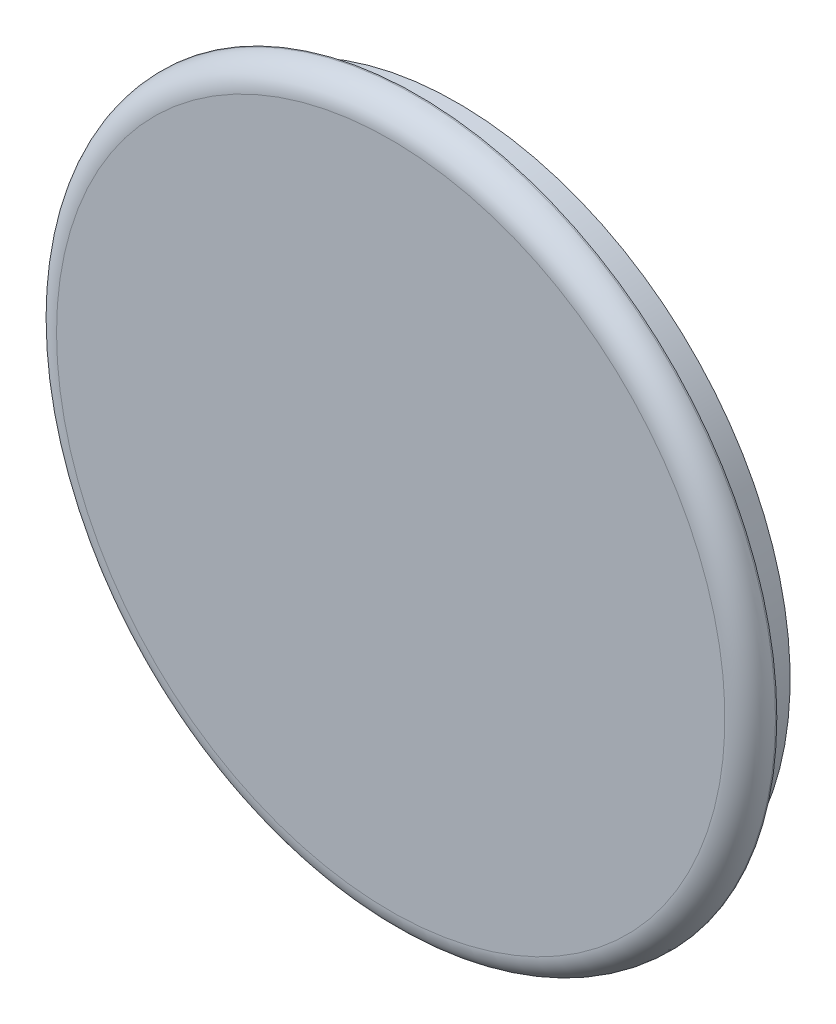
ISO-10303-21;
HEADER;
FILE_DESCRIPTION(('STEP AP214'),'2;1');
FILE_NAME('part.step','',(''),(''),'','','');
FILE_SCHEMA(('AUTOMOTIVE_DESIGN { 1 0 10303 214 1 1 1 1 }'));
ENDSEC;
DATA;
#1=APPLICATION_CONTEXT('core data for automotive mechanical design processes');
#2=APPLICATION_PROTOCOL_DEFINITION('international standard','automotive_design',2000,#1);
#3=PRODUCT_CONTEXT('',#1,'mechanical');
#4=PRODUCT('Part','Part','',(#3));
#5=PRODUCT_RELATED_PRODUCT_CATEGORY('part','',(#4));
#6=PRODUCT_DEFINITION_FORMATION('','',#4);
#7=PRODUCT_DEFINITION_CONTEXT('part definition',#1,'design');
#8=PRODUCT_DEFINITION('design','',#6,#7);
#9=PRODUCT_DEFINITION_SHAPE('','',#8);
#10=(LENGTH_UNIT() NAMED_UNIT(*) SI_UNIT(.MILLI.,.METRE.));
#11=(NAMED_UNIT(*) PLANE_ANGLE_UNIT() SI_UNIT($,.RADIAN.));
#12=(NAMED_UNIT(*) SI_UNIT($,.STERADIAN.) SOLID_ANGLE_UNIT());
#13=UNCERTAINTY_MEASURE_WITH_UNIT(LENGTH_MEASURE(1.E-05),#10,'distance_accuracy_value','');
#14=(GEOMETRIC_REPRESENTATION_CONTEXT(3) GLOBAL_UNCERTAINTY_ASSIGNED_CONTEXT((#13)) GLOBAL_UNIT_ASSIGNED_CONTEXT((#10,
#11,#12)) REPRESENTATION_CONTEXT('',''));
#15=CARTESIAN_POINT('',(0.,0.,0.));
#16=DIRECTION('',(0.,0.,1.));
#17=DIRECTION('',(1.,0.,0.));
#18=AXIS2_PLACEMENT_3D('',#15,#16,#17);
#19=CARTESIAN_POINT('',(0.,0.,0.));
#20=DIRECTION('',(0.,0.,-1.));
#21=DIRECTION('',(-1.,0.,0.));
#22=AXIS2_PLACEMENT_3D('',#19,#20,#21);
#23=PLANE('',#22);
#24=CARTESIAN_POINT('',(0.,0.,0.));
#25=DIRECTION('',(0.,0.,-1.));
#26=DIRECTION('',(-1.,0.,0.));
#27=AXIS2_PLACEMENT_3D('',#24,#25,#26);
#28=CIRCLE('',#27,25.1);
#29=CARTESIAN_POINT('',(-25.1,0.,0.));
#30=VERTEX_POINT('',#29);
#31=EDGE_CURVE('E10',#30,#30,#28,.T.);
#32=ORIENTED_EDGE('',*,*,#31,.F.);
#33=EDGE_LOOP('',(#32));
#34=FACE_BOUND('',#33,.T.);
#35=ADVANCED_FACE('F35',(#34),#23,.F.);
#36=CARTESIAN_POINT('',(0.,0.,-1.9));
#37=DIRECTION('',(0.,0.,-1.));
#38=DIRECTION('',(-1.,0.,0.));
#39=AXIS2_PLACEMENT_3D('',#36,#37,#38);
#40=TOROIDAL_SURFACE('',#39,25.1,1.9);
#41=CARTESIAN_POINT('',(0.,0.,-1.90000000000002));
#42=DIRECTION('',(0.,0.,-1.));
#43=DIRECTION('',(-1.,0.,0.));
#44=AXIS2_PLACEMENT_3D('',#41,#42,#43);
#45=CIRCLE('',#44,27.);
#46=CARTESIAN_POINT('',(-27.,0.,-1.90000000000002));
#47=VERTEX_POINT('',#46);
#48=EDGE_CURVE('E41',#47,#47,#45,.T.);
#49=ORIENTED_EDGE('',*,*,#48,.F.);
#50=EDGE_LOOP('',(#49));
#51=FACE_BOUND('',#50,.T.);
#52=ORIENTED_EDGE('',*,*,#31,.T.);
#53=EDGE_LOOP('',(#52));
#54=FACE_BOUND('',#53,.T.);
#55=ADVANCED_FACE('F92',(#51,#54),#40,.T.);
#56=CARTESIAN_POINT('',(0.,0.,-2.));
#57=DIRECTION('',(0.,0.,-1.));
#58=DIRECTION('',(-1.,0.,0.));
#59=AXIS2_PLACEMENT_3D('',#56,#57,#58);
#60=CYLINDRICAL_SURFACE('',#59,27.);
#61=CARTESIAN_POINT('',(0.,0.,-2.));
#62=DIRECTION('',(0.,0.,-1.));
#63=DIRECTION('',(-1.,0.,0.));
#64=AXIS2_PLACEMENT_3D('',#61,#62,#63);
#65=CIRCLE('',#64,27.);
#66=CARTESIAN_POINT('',(-27.,0.,-2.00000000000001));
#67=VERTEX_POINT('',#66);
#68=EDGE_CURVE('E45',#67,#67,#65,.T.);
#69=ORIENTED_EDGE('',*,*,#68,.F.);
#70=EDGE_LOOP('',(#69));
#71=FACE_BOUND('',#70,.T.);
#72=ORIENTED_EDGE('',*,*,#48,.T.);
#73=EDGE_LOOP('',(#72));
#74=FACE_BOUND('',#73,.T.);
#75=ADVANCED_FACE('F87',(#71,#74),#60,.T.);
#76=CARTESIAN_POINT('',(27.,0.,-2.));
#77=DIRECTION('',(0.,0.,1.));
#78=DIRECTION('',(1.,0.,0.));
#79=AXIS2_PLACEMENT_3D('',#76,#77,#78);
#80=PLANE('',#79);
#81=CARTESIAN_POINT('',(0.,0.,-2.));
#82=DIRECTION('',(0.,0.,-1.));
#83=DIRECTION('',(-1.,0.,0.));
#84=AXIS2_PLACEMENT_3D('',#81,#82,#83);
#85=CIRCLE('',#84,25.);
#86=CARTESIAN_POINT('',(-25.,0.,-2.00000000000001));
#87=VERTEX_POINT('',#86);
#88=EDGE_CURVE('E49',#87,#87,#85,.T.);
#89=ORIENTED_EDGE('',*,*,#88,.F.);
#90=EDGE_LOOP('',(#89));
#91=FACE_BOUND('',#90,.T.);
#92=ORIENTED_EDGE('',*,*,#68,.T.);
#93=EDGE_LOOP('',(#92));
#94=FACE_BOUND('',#93,.T.);
#95=ADVANCED_FACE('F81',(#91,#94),#80,.F.);
#96=CARTESIAN_POINT('',(0.,0.,-2.));
#97=DIRECTION('',(0.,0.,-1.));
#98=DIRECTION('',(-1.,0.,0.));
#99=AXIS2_PLACEMENT_3D('',#96,#97,#98);
#100=CYLINDRICAL_SURFACE('',#99,25.);
#101=CARTESIAN_POINT('',(0.,0.,-5.));
#102=DIRECTION('',(0.,0.,-1.));
#103=DIRECTION('',(-1.,0.,0.));
#104=AXIS2_PLACEMENT_3D('',#101,#102,#103);
#105=CIRCLE('',#104,25.);
#106=CARTESIAN_POINT('',(-25.,0.,-5.));
#107=VERTEX_POINT('',#106);
#108=EDGE_CURVE('E54',#107,#107,#105,.T.);
#109=ORIENTED_EDGE('',*,*,#108,.F.);
#110=EDGE_LOOP('',(#109));
#111=FACE_BOUND('',#110,.T.);
#112=ORIENTED_EDGE('',*,*,#88,.T.);
#113=EDGE_LOOP('',(#112));
#114=FACE_BOUND('',#113,.T.);
#115=ADVANCED_FACE('F75',(#111,#114),#100,.T.);
#116=CARTESIAN_POINT('',(25.,0.,-5.));
#117=DIRECTION('',(0.,0.,1.));
#118=DIRECTION('',(1.,0.,0.));
#119=AXIS2_PLACEMENT_3D('',#116,#117,#118);
#120=PLANE('',#119);
#121=CARTESIAN_POINT('',(0.,0.,-5.));
#122=DIRECTION('',(0.,0.,-1.));
#123=DIRECTION('',(-1.,0.,0.));
#124=AXIS2_PLACEMENT_3D('',#121,#122,#123);
#125=CIRCLE('',#124,23.);
#126=CARTESIAN_POINT('',(-23.,0.,-5.));
#127=VERTEX_POINT('',#126);
#128=EDGE_CURVE('E57',#127,#127,#125,.T.);
#129=ORIENTED_EDGE('',*,*,#128,.F.);
#130=EDGE_LOOP('',(#129));
#131=FACE_BOUND('',#130,.T.);
#132=ORIENTED_EDGE('',*,*,#108,.T.);
#133=EDGE_LOOP('',(#132));
#134=FACE_BOUND('',#133,.T.);
#135=ADVANCED_FACE('F69',(#131,#134),#120,.F.);
#136=CARTESIAN_POINT('',(0.,0.,-2.));
#137=DIRECTION('',(0.,0.,-1.));
#138=DIRECTION('',(-1.,0.,0.));
#139=AXIS2_PLACEMENT_3D('',#136,#137,#138);
#140=CYLINDRICAL_SURFACE('',#139,23.);
#141=CARTESIAN_POINT('',(0.,0.,-2.));
#142=DIRECTION('',(0.,0.,-1.));
#143=DIRECTION('',(-1.,0.,0.));
#144=AXIS2_PLACEMENT_3D('',#141,#142,#143);
#145=CIRCLE('',#144,23.);
#146=CARTESIAN_POINT('',(-23.,0.,-2.));
#147=VERTEX_POINT('',#146);
#148=EDGE_CURVE('E60',#147,#147,#145,.T.);
#149=ORIENTED_EDGE('',*,*,#148,.F.);
#150=EDGE_LOOP('',(#149));
#151=FACE_BOUND('',#150,.T.);
#152=ORIENTED_EDGE('',*,*,#128,.T.);
#153=EDGE_LOOP('',(#152));
#154=FACE_BOUND('',#153,.T.);
#155=ADVANCED_FACE('F66',(#151,#154),#140,.F.);
#156=CARTESIAN_POINT('',(23.,0.,-2.));
#157=DIRECTION('',(0.,0.,1.));
#158=DIRECTION('',(1.,0.,0.));
#159=AXIS2_PLACEMENT_3D('',#156,#157,#158);
#160=PLANE('',#159);
#161=ORIENTED_EDGE('',*,*,#148,.T.);
#162=EDGE_LOOP('',(#161));
#163=FACE_BOUND('',#162,.T.);
#164=ADVANCED_FACE('F64',(#163),#160,.F.);
#165=CLOSED_SHELL('',(#35,#55,#75,#95,#115,#135,#155,#164));
#166=MANIFOLD_SOLID_BREP('B2',#165);
#167=ADVANCED_BREP_SHAPE_REPRESENTATION('',(#18,#166),#14);
#168=SHAPE_DEFINITION_REPRESENTATION(#9,#167);
ENDSEC;
END-ISO-10303-21;
